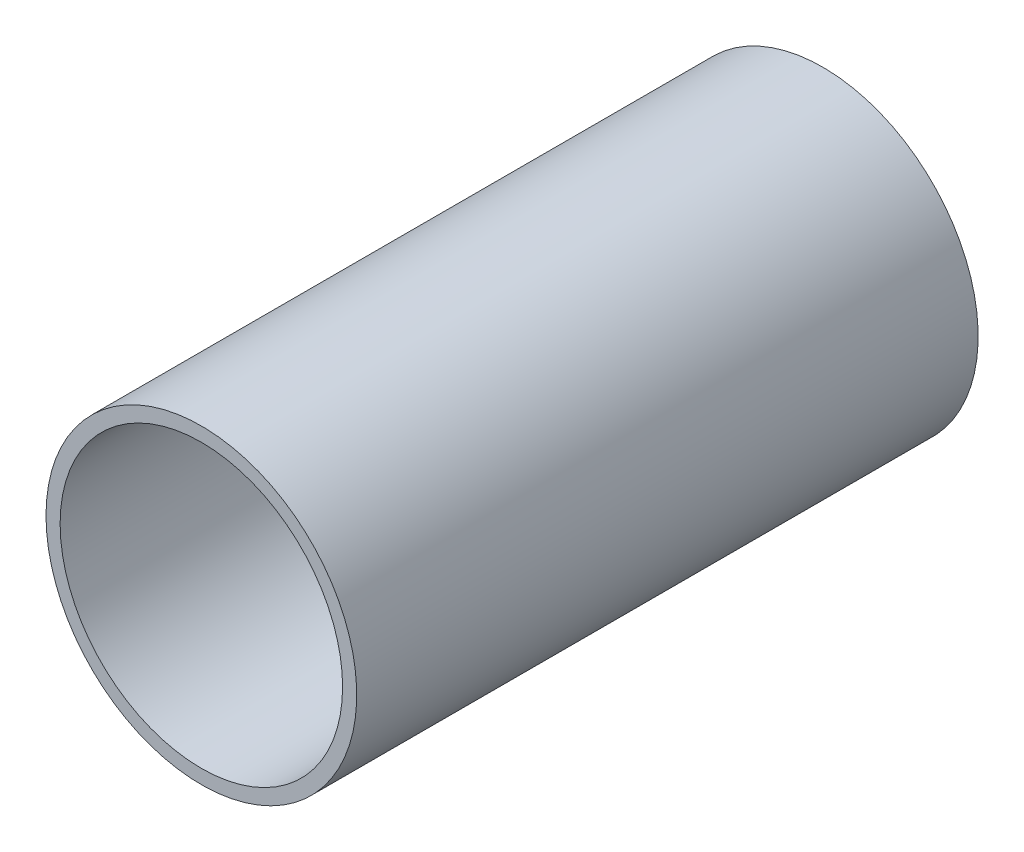
ISO-10303-21;
HEADER;
FILE_DESCRIPTION(('STEP AP214'),'2;1');
FILE_NAME('part.step','',(''),(''),'','','');
FILE_SCHEMA(('AUTOMOTIVE_DESIGN { 1 0 10303 214 1 1 1 1 }'));
ENDSEC;
DATA;
#1=APPLICATION_CONTEXT('core data for automotive mechanical design processes');
#2=APPLICATION_PROTOCOL_DEFINITION('international standard','automotive_design',2000,#1);
#3=PRODUCT_CONTEXT('',#1,'mechanical');
#4=PRODUCT('Part','Part','',(#3));
#5=PRODUCT_RELATED_PRODUCT_CATEGORY('part','',(#4));
#6=PRODUCT_DEFINITION_FORMATION('','',#4);
#7=PRODUCT_DEFINITION_CONTEXT('part definition',#1,'design');
#8=PRODUCT_DEFINITION('design','',#6,#7);
#9=PRODUCT_DEFINITION_SHAPE('','',#8);
#10=(LENGTH_UNIT() NAMED_UNIT(*) SI_UNIT(.MILLI.,.METRE.));
#11=(NAMED_UNIT(*) PLANE_ANGLE_UNIT() SI_UNIT($,.RADIAN.));
#12=(NAMED_UNIT(*) SI_UNIT($,.STERADIAN.) SOLID_ANGLE_UNIT());
#13=UNCERTAINTY_MEASURE_WITH_UNIT(LENGTH_MEASURE(1.E-05),#10,'distance_accuracy_value','');
#14=(GEOMETRIC_REPRESENTATION_CONTEXT(3) GLOBAL_UNCERTAINTY_ASSIGNED_CONTEXT((#13)) GLOBAL_UNIT_ASSIGNED_CONTEXT((#10,
#11,#12)) REPRESENTATION_CONTEXT('',''));
#15=CARTESIAN_POINT('',(0.,0.,0.));
#16=DIRECTION('',(0.,0.,1.));
#17=DIRECTION('',(1.,0.,0.));
#18=AXIS2_PLACEMENT_3D('',#15,#16,#17);
#19=CARTESIAN_POINT('',(0.,0.,0.));
#20=DIRECTION('',(0.,0.,1.));
#21=DIRECTION('',(-1.,0.,0.));
#22=AXIS2_PLACEMENT_3D('',#19,#20,#21);
#23=CYLINDRICAL_SURFACE('',#22,10.);
#24=CARTESIAN_POINT('',(0.,0.,44.));
#25=DIRECTION('',(0.,0.,-1.));
#26=DIRECTION('',(-1.,0.,0.));
#27=AXIS2_PLACEMENT_3D('',#24,#25,#26);
#28=CIRCLE('',#27,10.);
#29=CARTESIAN_POINT('',(-10.,0.,44.));
#30=VERTEX_POINT('',#29);
#31=EDGE_CURVE('E23',#30,#30,#28,.T.);
#32=ORIENTED_EDGE('',*,*,#31,.F.);
#33=EDGE_LOOP('',(#32));
#34=FACE_BOUND('',#33,.T.);
#35=CARTESIAN_POINT('',(0.,0.,0.));
#36=DIRECTION('',(0.,0.,1.));
#37=DIRECTION('',(-1.,0.,0.));
#38=AXIS2_PLACEMENT_3D('',#35,#36,#37);
#39=CIRCLE('',#38,10.);
#40=CARTESIAN_POINT('',(-10.,0.,0.));
#41=VERTEX_POINT('',#40);
#42=EDGE_CURVE('E29',#41,#41,#39,.T.);
#43=ORIENTED_EDGE('',*,*,#42,.F.);
#44=EDGE_LOOP('',(#43));
#45=FACE_BOUND('',#44,.T.);
#46=ADVANCED_FACE('F15',(#34,#45),#23,.F.);
#47=CARTESIAN_POINT('',(0.,0.,0.));
#48=DIRECTION('',(0.,0.,1.));
#49=DIRECTION('',(-1.,0.,0.));
#50=AXIS2_PLACEMENT_3D('',#47,#48,#49);
#51=CYLINDRICAL_SURFACE('',#50,11.);
#52=CARTESIAN_POINT('',(0.,0.,44.));
#53=DIRECTION('',(0.,0.,-1.));
#54=DIRECTION('',(-1.,0.,0.));
#55=AXIS2_PLACEMENT_3D('',#52,#53,#54);
#56=CIRCLE('',#55,11.);
#57=CARTESIAN_POINT('',(-11.,0.,44.));
#58=VERTEX_POINT('',#57);
#59=EDGE_CURVE('E10',#58,#58,#56,.T.);
#60=ORIENTED_EDGE('',*,*,#59,.T.);
#61=EDGE_LOOP('',(#60));
#62=FACE_BOUND('',#61,.T.);
#63=CARTESIAN_POINT('',(0.,0.,0.));
#64=DIRECTION('',(0.,0.,-1.));
#65=DIRECTION('',(-1.,0.,0.));
#66=AXIS2_PLACEMENT_3D('',#63,#64,#65);
#67=CIRCLE('',#66,11.);
#68=CARTESIAN_POINT('',(-11.,0.,0.));
#69=VERTEX_POINT('',#68);
#70=EDGE_CURVE('E19',#69,#69,#67,.T.);
#71=ORIENTED_EDGE('',*,*,#70,.F.);
#72=EDGE_LOOP('',(#71));
#73=FACE_BOUND('',#72,.T.);
#74=ADVANCED_FACE('F37',(#62,#73),#51,.T.);
#75=CARTESIAN_POINT('',(0.,0.,44.));
#76=DIRECTION('',(0.,0.,-1.));
#77=DIRECTION('',(-1.,0.,0.));
#78=AXIS2_PLACEMENT_3D('',#75,#76,#77);
#79=PLANE('',#78);
#80=ORIENTED_EDGE('',*,*,#59,.F.);
#81=EDGE_LOOP('',(#80));
#82=FACE_BOUND('',#81,.T.);
#83=ORIENTED_EDGE('',*,*,#31,.T.);
#84=EDGE_LOOP('',(#83));
#85=FACE_BOUND('',#84,.T.);
#86=ADVANCED_FACE('F39',(#82,#85),#79,.F.);
#87=CARTESIAN_POINT('',(0.,0.,0.));
#88=DIRECTION('',(0.,0.,-1.));
#89=DIRECTION('',(-1.,0.,0.));
#90=AXIS2_PLACEMENT_3D('',#87,#88,#89);
#91=PLANE('',#90);
#92=ORIENTED_EDGE('',*,*,#70,.T.);
#93=EDGE_LOOP('',(#92));
#94=FACE_BOUND('',#93,.T.);
#95=ORIENTED_EDGE('',*,*,#42,.T.);
#96=EDGE_LOOP('',(#95));
#97=FACE_BOUND('',#96,.T.);
#98=ADVANCED_FACE('F17',(#94,#97),#91,.T.);
#99=CLOSED_SHELL('',(#46,#74,#86,#98));
#100=MANIFOLD_SOLID_BREP('B1',#99);
#101=ADVANCED_BREP_SHAPE_REPRESENTATION('',(#18,#100),#14);
#102=SHAPE_DEFINITION_REPRESENTATION(#9,#101);
ENDSEC;
END-ISO-10303-21;
